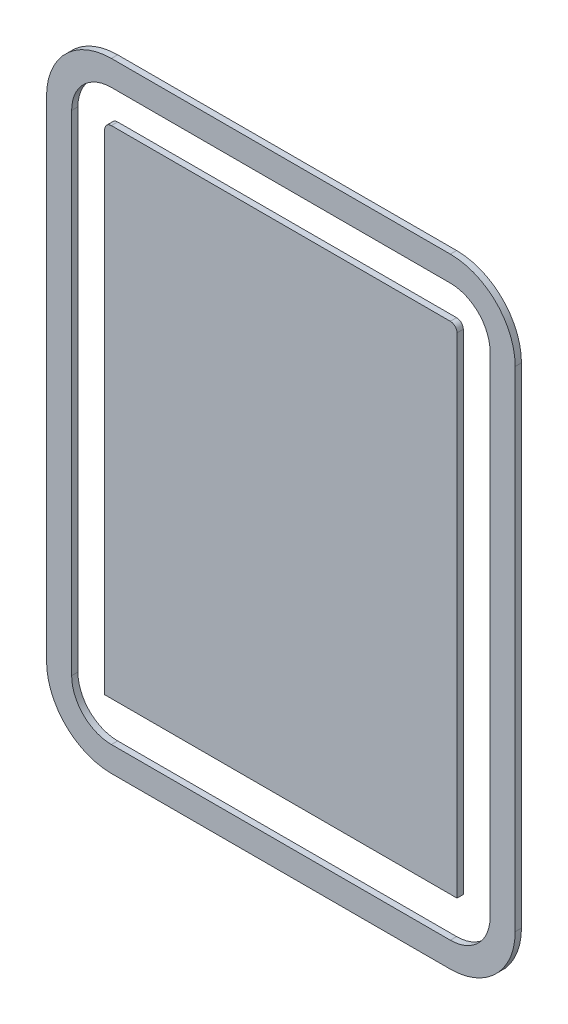
ISO-10303-21;
HEADER;
FILE_DESCRIPTION(('STEP AP214'),'2;1');
FILE_NAME('part.step','',(''),(''),'','','');
FILE_SCHEMA(('AUTOMOTIVE_DESIGN { 1 0 10303 214 1 1 1 1 }'));
ENDSEC;
DATA;
#1=APPLICATION_CONTEXT('core data for automotive mechanical design processes');
#2=APPLICATION_PROTOCOL_DEFINITION('international standard','automotive_design',2000,#1);
#3=PRODUCT_CONTEXT('',#1,'mechanical');
#4=PRODUCT('Part','Part','',(#3));
#5=PRODUCT_RELATED_PRODUCT_CATEGORY('part','',(#4));
#6=PRODUCT_DEFINITION_FORMATION('','',#4);
#7=PRODUCT_DEFINITION_CONTEXT('part definition',#1,'design');
#8=PRODUCT_DEFINITION('design','',#6,#7);
#9=PRODUCT_DEFINITION_SHAPE('','',#8);
#10=(LENGTH_UNIT() NAMED_UNIT(*) SI_UNIT(.MILLI.,.METRE.));
#11=(NAMED_UNIT(*) PLANE_ANGLE_UNIT() SI_UNIT($,.RADIAN.));
#12=(NAMED_UNIT(*) SI_UNIT($,.STERADIAN.) SOLID_ANGLE_UNIT());
#13=UNCERTAINTY_MEASURE_WITH_UNIT(LENGTH_MEASURE(1.E-05),#10,'distance_accuracy_value','');
#14=(GEOMETRIC_REPRESENTATION_CONTEXT(3) GLOBAL_UNCERTAINTY_ASSIGNED_CONTEXT((#13)) GLOBAL_UNIT_ASSIGNED_CONTEXT((#10,
#11,#12)) REPRESENTATION_CONTEXT('',''));
#15=CARTESIAN_POINT('',(0.,0.,0.));
#16=DIRECTION('',(0.,0.,1.));
#17=DIRECTION('',(1.,0.,0.));
#18=AXIS2_PLACEMENT_3D('',#15,#16,#17);
#19=CARTESIAN_POINT('',(0.,37.0709038415657,1.5));
#20=DIRECTION('',(0.,-1.,0.));
#21=DIRECTION('',(1.,0.,0.));
#22=AXIS2_PLACEMENT_3D('',#19,#20,#21);
#23=PLANE('',#22);
#24=DIRECTION('',(-1.,0.,0.));
#25=VECTOR('',#24,1.);
#26=CARTESIAN_POINT('',(0.,37.0709038415657,0.));
#27=LINE('',#26,#25);
#28=CARTESIAN_POINT('',(21.0767327904211,37.0709038415657,0.));
#29=VERTEX_POINT('',#28);
#30=CARTESIAN_POINT('',(-59.9232672095789,37.0709038415657,0.));
#31=VERTEX_POINT('',#30);
#32=EDGE_CURVE('E171',#29,#31,#27,.T.);
#33=ORIENTED_EDGE('',*,*,#32,.T.);
#34=DIRECTION('',(0.,0.,-1.));
#35=VECTOR('',#34,1.);
#36=CARTESIAN_POINT('',(-59.9232672095789,37.0709038415657,1.5));
#37=LINE('',#36,#35);
#38=CARTESIAN_POINT('',(-59.9232672095789,37.0709038415657,1.5));
#39=VERTEX_POINT('',#38);
#40=EDGE_CURVE('E13',#39,#31,#37,.T.);
#41=ORIENTED_EDGE('',*,*,#40,.F.);
#42=DIRECTION('',(-1.,0.,0.));
#43=VECTOR('',#42,1.);
#44=CARTESIAN_POINT('',(0.,37.0709038415657,1.5));
#45=LINE('',#44,#43);
#46=CARTESIAN_POINT('',(21.0767327904211,37.0709038415657,1.5));
#47=VERTEX_POINT('',#46);
#48=EDGE_CURVE('E181',#47,#39,#45,.T.);
#49=ORIENTED_EDGE('',*,*,#48,.F.);
#50=DIRECTION('',(0.,0.,-1.));
#51=VECTOR('',#50,1.);
#52=CARTESIAN_POINT('',(21.0767327904211,37.0709038415657,1.5));
#53=LINE('',#52,#51);
#54=EDGE_CURVE('E167',#47,#29,#53,.T.);
#55=ORIENTED_EDGE('',*,*,#54,.T.);
#56=EDGE_LOOP('',(#33,#41,#49,#55));
#57=FACE_BOUND('',#56,.T.);
#58=ADVANCED_FACE('F87',(#57),#23,.F.);
#59=CARTESIAN_POINT('',(-59.9232672095789,35.4709038415657,1.5));
#60=DIRECTION('',(0.,0.,-1.));
#61=DIRECTION('',(-1.,0.,0.));
#62=AXIS2_PLACEMENT_3D('',#59,#60,#61);
#63=CYLINDRICAL_SURFACE('',#62,1.60000000000001);
#64=CARTESIAN_POINT('',(-59.9232672095789,35.4709038415657,0.));
#65=DIRECTION('',(0.,0.,1.));
#66=DIRECTION('',(1.,0.,0.));
#67=AXIS2_PLACEMENT_3D('',#64,#65,#66);
#68=CIRCLE('',#67,1.60000000000001);
#69=CARTESIAN_POINT('',(-61.5232672095789,35.4709038415657,0.));
#70=VERTEX_POINT('',#69);
#71=EDGE_CURVE('E174',#31,#70,#68,.T.);
#72=ORIENTED_EDGE('',*,*,#71,.T.);
#73=DIRECTION('',(0.,0.,-1.));
#74=VECTOR('',#73,1.);
#75=CARTESIAN_POINT('',(-61.5232672095789,35.4709038415657,1.5));
#76=LINE('',#75,#74);
#77=CARTESIAN_POINT('',(-61.5232672095789,35.4709038415657,1.5));
#78=VERTEX_POINT('',#77);
#79=EDGE_CURVE('E95',#78,#70,#76,.T.);
#80=ORIENTED_EDGE('',*,*,#79,.F.);
#81=CARTESIAN_POINT('',(-59.9232672095789,35.4709038415657,1.5));
#82=DIRECTION('',(0.,0.,1.));
#83=DIRECTION('',(1.,0.,0.));
#84=AXIS2_PLACEMENT_3D('',#81,#82,#83);
#85=CIRCLE('',#84,1.60000000000001);
#86=EDGE_CURVE('E140',#39,#78,#85,.T.);
#87=ORIENTED_EDGE('',*,*,#86,.F.);
#88=ORIENTED_EDGE('',*,*,#40,.T.);
#89=EDGE_LOOP('',(#72,#80,#87,#88));
#90=FACE_BOUND('',#89,.T.);
#91=ADVANCED_FACE('F205',(#90),#63,.T.);
#92=CARTESIAN_POINT('',(-61.5232672095789,0.,1.5));
#93=DIRECTION('',(1.,0.,0.));
#94=DIRECTION('',(0.,1.,0.));
#95=AXIS2_PLACEMENT_3D('',#92,#93,#94);
#96=PLANE('',#95);
#97=DIRECTION('',(0.,-1.,0.));
#98=VECTOR('',#97,1.);
#99=CARTESIAN_POINT('',(-61.5232672095789,0.,0.));
#100=LINE('',#99,#98);
#101=CARTESIAN_POINT('',(-61.5232672095789,-81.5290961584343,0.));
#102=VERTEX_POINT('',#101);
#103=EDGE_CURVE('E176',#70,#102,#100,.T.);
#104=ORIENTED_EDGE('',*,*,#103,.T.);
#105=DIRECTION('',(0.,0.,-1.));
#106=VECTOR('',#105,1.);
#107=CARTESIAN_POINT('',(-61.5232672095789,-81.5290961584343,1.5));
#108=LINE('',#107,#106);
#109=CARTESIAN_POINT('',(-61.5232672095789,-81.5290961584343,1.5));
#110=VERTEX_POINT('',#109);
#111=EDGE_CURVE('E162',#110,#102,#108,.T.);
#112=ORIENTED_EDGE('',*,*,#111,.F.);
#113=DIRECTION('',(0.,-1.,0.));
#114=VECTOR('',#113,1.);
#115=CARTESIAN_POINT('',(-61.5232672095789,0.,1.5));
#116=LINE('',#115,#114);
#117=EDGE_CURVE('E153',#78,#110,#116,.T.);
#118=ORIENTED_EDGE('',*,*,#117,.F.);
#119=ORIENTED_EDGE('',*,*,#79,.T.);
#120=EDGE_LOOP('',(#104,#112,#118,#119));
#121=FACE_BOUND('',#120,.T.);
#122=ADVANCED_FACE('F187',(#121),#96,.F.);
#123=CARTESIAN_POINT('',(0.,-81.5290961584343,1.5));
#124=DIRECTION('',(0.,1.,0.));
#125=DIRECTION('',(0.,0.,1.));
#126=AXIS2_PLACEMENT_3D('',#123,#124,#125);
#127=PLANE('',#126);
#128=DIRECTION('',(1.,0.,0.));
#129=VECTOR('',#128,1.);
#130=CARTESIAN_POINT('',(0.,-81.5290961584343,0.));
#131=LINE('',#130,#129);
#132=CARTESIAN_POINT('',(22.6767327904211,-81.5290961584343,0.));
#133=VERTEX_POINT('',#132);
#134=EDGE_CURVE('E161',#102,#133,#131,.T.);
#135=ORIENTED_EDGE('',*,*,#134,.T.);
#136=DIRECTION('',(0.,0.,-1.));
#137=VECTOR('',#136,1.);
#138=CARTESIAN_POINT('',(22.6767327904211,-81.5290961584343,1.5));
#139=LINE('',#138,#137);
#140=CARTESIAN_POINT('',(22.6767327904211,-81.5290961584343,1.5));
#141=VERTEX_POINT('',#140);
#142=EDGE_CURVE('E158',#141,#133,#139,.T.);
#143=ORIENTED_EDGE('',*,*,#142,.F.);
#144=DIRECTION('',(1.,0.,0.));
#145=VECTOR('',#144,1.);
#146=CARTESIAN_POINT('',(0.,-81.5290961584343,1.5));
#147=LINE('',#146,#145);
#148=EDGE_CURVE('E147',#110,#141,#147,.T.);
#149=ORIENTED_EDGE('',*,*,#148,.F.);
#150=ORIENTED_EDGE('',*,*,#111,.T.);
#151=EDGE_LOOP('',(#135,#143,#149,#150));
#152=FACE_BOUND('',#151,.T.);
#153=ADVANCED_FACE('F159',(#152),#127,.F.);
#154=CARTESIAN_POINT('',(22.6767327904211,0.,1.5));
#155=DIRECTION('',(-1.,0.,0.));
#156=DIRECTION('',(0.,0.,1.));
#157=AXIS2_PLACEMENT_3D('',#154,#155,#156);
#158=PLANE('',#157);
#159=DIRECTION('',(0.,1.,0.));
#160=VECTOR('',#159,1.);
#161=CARTESIAN_POINT('',(22.6767327904211,0.,0.));
#162=LINE('',#161,#160);
#163=CARTESIAN_POINT('',(22.6767327904211,35.4709038415657,0.));
#164=VERTEX_POINT('',#163);
#165=EDGE_CURVE('E126',#133,#164,#162,.T.);
#166=ORIENTED_EDGE('',*,*,#165,.T.);
#167=DIRECTION('',(0.,0.,-1.));
#168=VECTOR('',#167,1.);
#169=CARTESIAN_POINT('',(22.6767327904211,35.4709038415657,1.5));
#170=LINE('',#169,#168);
#171=CARTESIAN_POINT('',(22.6767327904211,35.4709038415657,1.5));
#172=VERTEX_POINT('',#171);
#173=EDGE_CURVE('E163',#172,#164,#170,.T.);
#174=ORIENTED_EDGE('',*,*,#173,.F.);
#175=DIRECTION('',(0.,1.,0.));
#176=VECTOR('',#175,1.);
#177=CARTESIAN_POINT('',(22.6767327904211,0.,1.5));
#178=LINE('',#177,#176);
#179=EDGE_CURVE('E151',#141,#172,#178,.T.);
#180=ORIENTED_EDGE('',*,*,#179,.F.);
#181=ORIENTED_EDGE('',*,*,#142,.T.);
#182=EDGE_LOOP('',(#166,#174,#180,#181));
#183=FACE_BOUND('',#182,.T.);
#184=ADVANCED_FACE('F165',(#183),#158,.F.);
#185=CARTESIAN_POINT('',(21.0767327904211,35.4709038415657,1.5));
#186=DIRECTION('',(0.,0.,-1.));
#187=DIRECTION('',(-1.,0.,0.));
#188=AXIS2_PLACEMENT_3D('',#185,#186,#187);
#189=CYLINDRICAL_SURFACE('',#188,1.6);
#190=CARTESIAN_POINT('',(21.0767327904211,35.4709038415657,0.));
#191=DIRECTION('',(0.,0.,1.));
#192=DIRECTION('',(1.,0.,0.));
#193=AXIS2_PLACEMENT_3D('',#190,#191,#192);
#194=CIRCLE('',#193,1.6);
#195=EDGE_CURVE('E132',#164,#29,#194,.T.);
#196=ORIENTED_EDGE('',*,*,#195,.T.);
#197=ORIENTED_EDGE('',*,*,#54,.F.);
#198=CARTESIAN_POINT('',(21.0767327904211,35.4709038415657,1.5));
#199=DIRECTION('',(0.,0.,1.));
#200=DIRECTION('',(1.,0.,0.));
#201=AXIS2_PLACEMENT_3D('',#198,#199,#200);
#202=CIRCLE('',#201,1.6);
#203=EDGE_CURVE('E103',#172,#47,#202,.T.);
#204=ORIENTED_EDGE('',*,*,#203,.F.);
#205=ORIENTED_EDGE('',*,*,#173,.T.);
#206=EDGE_LOOP('',(#196,#197,#204,#205));
#207=FACE_BOUND('',#206,.T.);
#208=ADVANCED_FACE('F194',(#207),#189,.T.);
#209=CARTESIAN_POINT('',(0.,0.,1.5));
#210=DIRECTION('',(0.,0.,1.));
#211=DIRECTION('',(1.,0.,0.));
#212=AXIS2_PLACEMENT_3D('',#209,#210,#211);
#213=PLANE('',#212);
#214=ORIENTED_EDGE('',*,*,#48,.T.);
#215=ORIENTED_EDGE('',*,*,#86,.T.);
#216=ORIENTED_EDGE('',*,*,#117,.T.);
#217=ORIENTED_EDGE('',*,*,#148,.T.);
#218=ORIENTED_EDGE('',*,*,#179,.T.);
#219=ORIENTED_EDGE('',*,*,#203,.T.);
#220=EDGE_LOOP('',(#214,#215,#216,#217,#218,#219));
#221=FACE_BOUND('',#220,.T.);
#222=ADVANCED_FACE('F149',(#221),#213,.T.);
#223=CARTESIAN_POINT('',(0.,0.,0.));
#224=DIRECTION('',(0.,0.,1.));
#225=DIRECTION('',(1.,0.,0.));
#226=AXIS2_PLACEMENT_3D('',#223,#224,#225);
#227=PLANE('',#226);
#228=ORIENTED_EDGE('',*,*,#32,.F.);
#229=ORIENTED_EDGE('',*,*,#195,.F.);
#230=ORIENTED_EDGE('',*,*,#165,.F.);
#231=ORIENTED_EDGE('',*,*,#134,.F.);
#232=ORIENTED_EDGE('',*,*,#103,.F.);
#233=ORIENTED_EDGE('',*,*,#71,.F.);
#234=EDGE_LOOP('',(#228,#229,#230,#231,#232,#233));
#235=FACE_BOUND('',#234,.T.);
#236=ADVANCED_FACE('F190',(#235),#227,.F.);
#237=CLOSED_SHELL('',(#58,#91,#122,#153,#184,#208,#222,#236));
#238=MANIFOLD_SOLID_BREP('B2',#237);
#239=CARTESIAN_POINT('',(0.,50.9709038415657,1.5));
#240=DIRECTION('',(0.,-1.,0.));
#241=DIRECTION('',(0.,0.,-1.));
#242=AXIS2_PLACEMENT_3D('',#239,#240,#241);
#243=PLANE('',#242);
#244=DIRECTION('',(-1.,0.,0.));
#245=VECTOR('',#244,1.);
#246=CARTESIAN_POINT('',(0.,50.9709038415657,0.));
#247=LINE('',#246,#245);
#248=CARTESIAN_POINT('',(21.0767327904211,50.9709038415657,0.));
#249=VERTEX_POINT('',#248);
#250=CARTESIAN_POINT('',(-59.9232672095789,50.9709038415657,0.));
#251=VERTEX_POINT('',#250);
#252=EDGE_CURVE('E435',#249,#251,#247,.T.);
#253=ORIENTED_EDGE('',*,*,#252,.T.);
#254=DIRECTION('',(0.,0.,-1.));
#255=VECTOR('',#254,1.);
#256=CARTESIAN_POINT('',(-59.9232672095789,50.9709038415657,1.5));
#257=LINE('',#256,#255);
#258=CARTESIAN_POINT('',(-59.9232672095789,50.9709038415657,1.5));
#259=VERTEX_POINT('',#258);
#260=EDGE_CURVE('E85',#259,#251,#257,.T.);
#261=ORIENTED_EDGE('',*,*,#260,.F.);
#262=DIRECTION('',(-1.,0.,0.));
#263=VECTOR('',#262,1.);
#264=CARTESIAN_POINT('',(0.,50.9709038415657,1.5));
#265=LINE('',#264,#263);
#266=CARTESIAN_POINT('',(21.0767327904211,50.9709038415657,1.5));
#267=VERTEX_POINT('',#266);
#268=EDGE_CURVE('E513',#267,#259,#265,.T.);
#269=ORIENTED_EDGE('',*,*,#268,.F.);
#270=DIRECTION('',(0.,0.,-1.));
#271=VECTOR('',#270,1.);
#272=CARTESIAN_POINT('',(21.0767327904211,50.9709038415657,1.5));
#273=LINE('',#272,#271);
#274=EDGE_CURVE('E450',#267,#249,#273,.T.);
#275=ORIENTED_EDGE('',*,*,#274,.T.);
#276=EDGE_LOOP('',(#253,#261,#269,#275));
#277=FACE_BOUND('',#276,.T.);
#278=ADVANCED_FACE('F263',(#277),#243,.F.);
#279=CARTESIAN_POINT('',(-59.9232672095789,35.4709038415657,1.5));
#280=DIRECTION('',(0.,0.,-1.));
#281=DIRECTION('',(-1.,0.,0.));
#282=AXIS2_PLACEMENT_3D('',#279,#280,#281);
#283=CYLINDRICAL_SURFACE('',#282,15.5);
#284=CARTESIAN_POINT('',(-59.9232672095789,35.4709038415657,0.));
#285=DIRECTION('',(0.,0.,1.));
#286=DIRECTION('',(1.,0.,0.));
#287=AXIS2_PLACEMENT_3D('',#284,#285,#286);
#288=CIRCLE('',#287,15.5);
#289=CARTESIAN_POINT('',(-75.4232672095789,35.4709038415657,0.));
#290=VERTEX_POINT('',#289);
#291=EDGE_CURVE('E438',#251,#290,#288,.T.);
#292=ORIENTED_EDGE('',*,*,#291,.T.);
#293=DIRECTION('',(0.,0.,-1.));
#294=VECTOR('',#293,1.);
#295=CARTESIAN_POINT('',(-75.4232672095789,35.4709038415657,1.5));
#296=LINE('',#295,#294);
#297=CARTESIAN_POINT('',(-75.4232672095789,35.4709038415657,1.5));
#298=VERTEX_POINT('',#297);
#299=EDGE_CURVE('E273',#298,#290,#296,.T.);
#300=ORIENTED_EDGE('',*,*,#299,.F.);
#301=CARTESIAN_POINT('',(-59.9232672095789,35.4709038415657,1.5));
#302=DIRECTION('',(0.,0.,1.));
#303=DIRECTION('',(1.,0.,0.));
#304=AXIS2_PLACEMENT_3D('',#301,#302,#303);
#305=CIRCLE('',#304,15.5);
#306=EDGE_CURVE('E515',#259,#298,#305,.T.);
#307=ORIENTED_EDGE('',*,*,#306,.F.);
#308=ORIENTED_EDGE('',*,*,#260,.T.);
#309=EDGE_LOOP('',(#292,#300,#307,#308));
#310=FACE_BOUND('',#309,.T.);
#311=ADVANCED_FACE('F550',(#310),#283,.T.);
#312=CARTESIAN_POINT('',(-75.4232672095789,0.,1.5));
#313=DIRECTION('',(1.,0.,0.));
#314=DIRECTION('',(0.,1.,0.));
#315=AXIS2_PLACEMENT_3D('',#312,#313,#314);
#316=PLANE('',#315);
#317=DIRECTION('',(0.,-1.,0.));
#318=VECTOR('',#317,1.);
#319=CARTESIAN_POINT('',(-75.4232672095789,0.,0.));
#320=LINE('',#319,#318);
#321=CARTESIAN_POINT('',(-75.4232672095789,-81.5290961584343,0.));
#322=VERTEX_POINT('',#321);
#323=EDGE_CURVE('E440',#290,#322,#320,.T.);
#324=ORIENTED_EDGE('',*,*,#323,.T.);
#325=DIRECTION('',(0.,0.,-1.));
#326=VECTOR('',#325,1.);
#327=CARTESIAN_POINT('',(-75.4232672095789,-81.5290961584343,1.5));
#328=LINE('',#327,#326);
#329=CARTESIAN_POINT('',(-75.4232672095789,-81.5290961584343,1.5));
#330=VERTEX_POINT('',#329);
#331=EDGE_CURVE('E457',#330,#322,#328,.T.);
#332=ORIENTED_EDGE('',*,*,#331,.F.);
#333=DIRECTION('',(0.,-1.,0.));
#334=VECTOR('',#333,1.);
#335=CARTESIAN_POINT('',(-75.4232672095789,0.,1.5));
#336=LINE('',#335,#334);
#337=EDGE_CURVE('E517',#298,#330,#336,.T.);
#338=ORIENTED_EDGE('',*,*,#337,.F.);
#339=ORIENTED_EDGE('',*,*,#299,.T.);
#340=EDGE_LOOP('',(#324,#332,#338,#339));
#341=FACE_BOUND('',#340,.T.);
#342=ADVANCED_FACE('F555',(#341),#316,.F.);
#343=CARTESIAN_POINT('',(-59.9232672095789,-81.5290961584343,1.5));
#344=DIRECTION('',(0.,0.,-1.));
#345=DIRECTION('',(-1.,0.,0.));
#346=AXIS2_PLACEMENT_3D('',#343,#344,#345);
#347=CYLINDRICAL_SURFACE('',#346,15.5);
#348=CARTESIAN_POINT('',(-59.9232672095789,-81.5290961584343,0.));
#349=DIRECTION('',(0.,0.,1.));
#350=DIRECTION('',(1.,0.,0.));
#351=AXIS2_PLACEMENT_3D('',#348,#349,#350);
#352=CIRCLE('',#351,15.5);
#353=CARTESIAN_POINT('',(-59.9232672095789,-97.0290961584343,0.));
#354=VERTEX_POINT('',#353);
#355=EDGE_CURVE('E442',#322,#354,#352,.T.);
#356=ORIENTED_EDGE('',*,*,#355,.T.);
#357=DIRECTION('',(0.,0.,-1.));
#358=VECTOR('',#357,1.);
#359=CARTESIAN_POINT('',(-59.9232672095789,-97.0290961584343,1.5));
#360=LINE('',#359,#358);
#361=CARTESIAN_POINT('',(-59.9232672095789,-97.0290961584343,1.5));
#362=VERTEX_POINT('',#361);
#363=EDGE_CURVE('E454',#362,#354,#360,.T.);
#364=ORIENTED_EDGE('',*,*,#363,.F.);
#365=CARTESIAN_POINT('',(-59.9232672095789,-81.5290961584343,1.5));
#366=DIRECTION('',(0.,0.,1.));
#367=DIRECTION('',(1.,0.,0.));
#368=AXIS2_PLACEMENT_3D('',#365,#366,#367);
#369=CIRCLE('',#368,15.5);
#370=EDGE_CURVE('E519',#330,#362,#369,.T.);
#371=ORIENTED_EDGE('',*,*,#370,.F.);
#372=ORIENTED_EDGE('',*,*,#331,.T.);
#373=EDGE_LOOP('',(#356,#364,#371,#372));
#374=FACE_BOUND('',#373,.T.);
#375=ADVANCED_FACE('F525',(#374),#347,.T.);
#376=CARTESIAN_POINT('',(0.,-97.0290961584343,1.5));
#377=DIRECTION('',(0.,1.,0.));
#378=DIRECTION('',(0.,0.,1.));
#379=AXIS2_PLACEMENT_3D('',#376,#377,#378);
#380=PLANE('',#379);
#381=DIRECTION('',(1.,0.,0.));
#382=VECTOR('',#381,1.);
#383=CARTESIAN_POINT('',(0.,-97.0290961584343,0.));
#384=LINE('',#383,#382);
#385=CARTESIAN_POINT('',(21.0767327904211,-97.0290961584343,0.));
#386=VERTEX_POINT('',#385);
#387=EDGE_CURVE('E444',#354,#386,#384,.T.);
#388=ORIENTED_EDGE('',*,*,#387,.T.);
#389=DIRECTION('',(0.,0.,-1.));
#390=VECTOR('',#389,1.);
#391=CARTESIAN_POINT('',(21.0767327904211,-97.0290961584343,1.5));
#392=LINE('',#391,#390);
#393=CARTESIAN_POINT('',(21.0767327904211,-97.0290961584343,1.5));
#394=VERTEX_POINT('',#393);
#395=EDGE_CURVE('E402',#394,#386,#392,.T.);
#396=ORIENTED_EDGE('',*,*,#395,.F.);
#397=DIRECTION('',(1.,0.,0.));
#398=VECTOR('',#397,1.);
#399=CARTESIAN_POINT('',(0.,-97.0290961584343,1.5));
#400=LINE('',#399,#398);
#401=EDGE_CURVE('E393',#362,#394,#400,.T.);
#402=ORIENTED_EDGE('',*,*,#401,.F.);
#403=ORIENTED_EDGE('',*,*,#363,.T.);
#404=EDGE_LOOP('',(#388,#396,#402,#403));
#405=FACE_BOUND('',#404,.T.);
#406=ADVANCED_FACE('F529',(#405),#380,.F.);
#407=CARTESIAN_POINT('',(21.0767327904211,-81.5290961584343,1.5));
#408=DIRECTION('',(0.,0.,-1.));
#409=DIRECTION('',(-1.,0.,0.));
#410=AXIS2_PLACEMENT_3D('',#407,#408,#409);
#411=CYLINDRICAL_SURFACE('',#410,15.5);
#412=CARTESIAN_POINT('',(21.0767327904211,-81.5290961584343,0.));
#413=DIRECTION('',(0.,0.,1.));
#414=DIRECTION('',(1.,0.,0.));
#415=AXIS2_PLACEMENT_3D('',#412,#413,#414);
#416=CIRCLE('',#415,15.5);
#417=CARTESIAN_POINT('',(36.5767327904211,-81.5290961584343,0.));
#418=VERTEX_POINT('',#417);
#419=EDGE_CURVE('E401',#386,#418,#416,.T.);
#420=ORIENTED_EDGE('',*,*,#419,.T.);
#421=DIRECTION('',(0.,0.,-1.));
#422=VECTOR('',#421,1.);
#423=CARTESIAN_POINT('',(36.5767327904211,-81.5290961584343,1.5));
#424=LINE('',#423,#422);
#425=CARTESIAN_POINT('',(36.5767327904211,-81.5290961584343,1.5));
#426=VERTEX_POINT('',#425);
#427=EDGE_CURVE('E398',#426,#418,#424,.T.);
#428=ORIENTED_EDGE('',*,*,#427,.F.);
#429=CARTESIAN_POINT('',(21.0767327904211,-81.5290961584343,1.5));
#430=DIRECTION('',(0.,0.,1.));
#431=DIRECTION('',(1.,0.,0.));
#432=AXIS2_PLACEMENT_3D('',#429,#430,#431);
#433=CIRCLE('',#432,15.5);
#434=EDGE_CURVE('E387',#394,#426,#433,.T.);
#435=ORIENTED_EDGE('',*,*,#434,.F.);
#436=ORIENTED_EDGE('',*,*,#395,.T.);
#437=EDGE_LOOP('',(#420,#428,#435,#436));
#438=FACE_BOUND('',#437,.T.);
#439=ADVANCED_FACE('F399',(#438),#411,.T.);
#440=CARTESIAN_POINT('',(36.5767327904211,0.,1.5));
#441=DIRECTION('',(-1.,0.,0.));
#442=DIRECTION('',(0.,-1.,0.));
#443=AXIS2_PLACEMENT_3D('',#440,#441,#442);
#444=PLANE('',#443);
#445=DIRECTION('',(0.,1.,0.));
#446=VECTOR('',#445,1.);
#447=CARTESIAN_POINT('',(36.5767327904211,0.,0.));
#448=LINE('',#447,#446);
#449=CARTESIAN_POINT('',(36.5767327904211,35.4709038415657,0.));
#450=VERTEX_POINT('',#449);
#451=EDGE_CURVE('E335',#418,#450,#448,.T.);
#452=ORIENTED_EDGE('',*,*,#451,.T.);
#453=DIRECTION('',(0.,0.,-1.));
#454=VECTOR('',#453,1.);
#455=CARTESIAN_POINT('',(36.5767327904211,35.4709038415657,1.5));
#456=LINE('',#455,#454);
#457=CARTESIAN_POINT('',(36.5767327904211,35.4709038415657,1.5));
#458=VERTEX_POINT('',#457);
#459=EDGE_CURVE('E403',#458,#450,#456,.T.);
#460=ORIENTED_EDGE('',*,*,#459,.F.);
#461=DIRECTION('',(0.,1.,0.));
#462=VECTOR('',#461,1.);
#463=CARTESIAN_POINT('',(36.5767327904211,0.,1.5));
#464=LINE('',#463,#462);
#465=EDGE_CURVE('E391',#426,#458,#464,.T.);
#466=ORIENTED_EDGE('',*,*,#465,.F.);
#467=ORIENTED_EDGE('',*,*,#427,.T.);
#468=EDGE_LOOP('',(#452,#460,#466,#467));
#469=FACE_BOUND('',#468,.T.);
#470=ADVANCED_FACE('F405',(#469),#444,.F.);
#471=CARTESIAN_POINT('',(-59.9232672095789,35.4709038415657,1.5));
#472=DIRECTION('',(0.,0.,-1.));
#473=DIRECTION('',(-1.,0.,0.));
#474=AXIS2_PLACEMENT_3D('',#471,#472,#473);
#475=CYLINDRICAL_SURFACE('',#474,9.5);
#476=CARTESIAN_POINT('',(-59.9232672095789,35.4709038415657,0.));
#477=DIRECTION('',(0.,0.,1.));
#478=DIRECTION('',(1.,0.,0.));
#479=AXIS2_PLACEMENT_3D('',#476,#477,#478);
#480=CIRCLE('',#479,9.5);
#481=CARTESIAN_POINT('',(-59.9232672095789,44.9709038415657,0.));
#482=VERTEX_POINT('',#481);
#483=CARTESIAN_POINT('',(-69.4232672095789,35.4709038415657,0.));
#484=VERTEX_POINT('',#483);
#485=EDGE_CURVE('E411',#482,#484,#480,.T.);
#486=ORIENTED_EDGE('',*,*,#485,.F.);
#487=DIRECTION('',(0.,0.,-1.));
#488=VECTOR('',#487,1.);
#489=CARTESIAN_POINT('',(-59.9232672095789,44.9709038415657,1.5));
#490=LINE('',#489,#488);
#491=CARTESIAN_POINT('',(-59.9232672095789,44.9709038415657,1.5));
#492=VERTEX_POINT('',#491);
#493=EDGE_CURVE('E267',#492,#482,#490,.T.);
#494=ORIENTED_EDGE('',*,*,#493,.F.);
#495=CARTESIAN_POINT('',(-59.9232672095789,35.4709038415657,1.5));
#496=DIRECTION('',(0.,0.,1.));
#497=DIRECTION('',(1.,0.,0.));
#498=AXIS2_PLACEMENT_3D('',#495,#496,#497);
#499=CIRCLE('',#498,9.5);
#500=CARTESIAN_POINT('',(-69.4232672095789,35.4709038415657,1.5));
#501=VERTEX_POINT('',#500);
#502=EDGE_CURVE('E449',#492,#501,#499,.T.);
#503=ORIENTED_EDGE('',*,*,#502,.T.);
#504=DIRECTION('',(0.,0.,-1.));
#505=VECTOR('',#504,1.);
#506=CARTESIAN_POINT('',(-69.4232672095789,35.4709038415657,1.5));
#507=LINE('',#506,#505);
#508=EDGE_CURVE('E407',#501,#484,#507,.T.);
#509=ORIENTED_EDGE('',*,*,#508,.T.);
#510=EDGE_LOOP('',(#486,#494,#503,#509));
#511=FACE_BOUND('',#510,.T.);
#512=ADVANCED_FACE('F265',(#511),#475,.F.);
#513=CARTESIAN_POINT('',(0.,44.9709038415657,1.5));
#514=DIRECTION('',(0.,-1.,0.));
#515=DIRECTION('',(0.,0.,-1.));
#516=AXIS2_PLACEMENT_3D('',#513,#514,#515);
#517=PLANE('',#516);
#518=DIRECTION('',(-1.,0.,0.));
#519=VECTOR('',#518,1.);
#520=CARTESIAN_POINT('',(0.,44.9709038415657,0.));
#521=LINE('',#520,#519);
#522=CARTESIAN_POINT('',(21.0767327904211,44.9709038415657,0.));
#523=VERTEX_POINT('',#522);
#524=EDGE_CURVE('E414',#523,#482,#521,.T.);
#525=ORIENTED_EDGE('',*,*,#524,.F.);
#526=DIRECTION('',(0.,0.,-1.));
#527=VECTOR('',#526,1.);
#528=CARTESIAN_POINT('',(21.0767327904211,44.9709038415657,1.5));
#529=LINE('',#528,#527);
#530=CARTESIAN_POINT('',(21.0767327904211,44.9709038415657,1.5));
#531=VERTEX_POINT('',#530);
#532=EDGE_CURVE('E472',#531,#523,#529,.T.);
#533=ORIENTED_EDGE('',*,*,#532,.F.);
#534=DIRECTION('',(-1.,0.,0.));
#535=VECTOR('',#534,1.);
#536=CARTESIAN_POINT('',(0.,44.9709038415657,1.5));
#537=LINE('',#536,#535);
#538=EDGE_CURVE('E481',#531,#492,#537,.T.);
#539=ORIENTED_EDGE('',*,*,#538,.T.);
#540=ORIENTED_EDGE('',*,*,#493,.T.);
#541=EDGE_LOOP('',(#525,#533,#539,#540));
#542=FACE_BOUND('',#541,.T.);
#543=ADVANCED_FACE('F479',(#542),#517,.T.);
#544=CARTESIAN_POINT('',(21.0767327904211,35.4709038415657,1.5));
#545=DIRECTION('',(0.,0.,-1.));
#546=DIRECTION('',(-1.,0.,0.));
#547=AXIS2_PLACEMENT_3D('',#544,#545,#546);
#548=CYLINDRICAL_SURFACE('',#547,9.5);
#549=CARTESIAN_POINT('',(21.0767327904211,35.4709038415657,0.));
#550=DIRECTION('',(0.,0.,1.));
#551=DIRECTION('',(1.,0.,0.));
#552=AXIS2_PLACEMENT_3D('',#549,#550,#551);
#553=CIRCLE('',#552,9.5);
#554=CARTESIAN_POINT('',(30.5767327904211,35.4709038415657,0.));
#555=VERTEX_POINT('',#554);
#556=EDGE_CURVE('E417',#555,#523,#553,.T.);
#557=ORIENTED_EDGE('',*,*,#556,.F.);
#558=DIRECTION('',(0.,0.,-1.));
#559=VECTOR('',#558,1.);
#560=CARTESIAN_POINT('',(30.5767327904211,35.4709038415657,1.5));
#561=LINE('',#560,#559);
#562=CARTESIAN_POINT('',(30.5767327904211,35.4709038415657,1.5));
#563=VERTEX_POINT('',#562);
#564=EDGE_CURVE('E471',#563,#555,#561,.T.);
#565=ORIENTED_EDGE('',*,*,#564,.F.);
#566=CARTESIAN_POINT('',(21.0767327904211,35.4709038415657,1.5));
#567=DIRECTION('',(0.,0.,1.));
#568=DIRECTION('',(1.,0.,0.));
#569=AXIS2_PLACEMENT_3D('',#566,#567,#568);
#570=CIRCLE('',#569,9.5);
#571=EDGE_CURVE('E489',#563,#531,#570,.T.);
#572=ORIENTED_EDGE('',*,*,#571,.T.);
#573=ORIENTED_EDGE('',*,*,#532,.T.);
#574=EDGE_LOOP('',(#557,#565,#572,#573));
#575=FACE_BOUND('',#574,.T.);
#576=ADVANCED_FACE('F487',(#575),#548,.F.);
#577=CARTESIAN_POINT('',(30.5767327904211,0.,1.5));
#578=DIRECTION('',(-1.,0.,0.));
#579=DIRECTION('',(0.,-1.,0.));
#580=AXIS2_PLACEMENT_3D('',#577,#578,#579);
#581=PLANE('',#580);
#582=DIRECTION('',(0.,1.,0.));
#583=VECTOR('',#582,1.);
#584=CARTESIAN_POINT('',(30.5767327904211,0.,0.));
#585=LINE('',#584,#583);
#586=CARTESIAN_POINT('',(30.5767327904211,-81.5290961584343,0.));
#587=VERTEX_POINT('',#586);
#588=EDGE_CURVE('E420',#587,#555,#585,.T.);
#589=ORIENTED_EDGE('',*,*,#588,.F.);
#590=DIRECTION('',(0.,0.,-1.));
#591=VECTOR('',#590,1.);
#592=CARTESIAN_POINT('',(30.5767327904211,-81.5290961584343,1.5));
#593=LINE('',#592,#591);
#594=CARTESIAN_POINT('',(30.5767327904211,-81.5290961584343,1.5));
#595=VERTEX_POINT('',#594);
#596=EDGE_CURVE('E469',#595,#587,#593,.T.);
#597=ORIENTED_EDGE('',*,*,#596,.F.);
#598=DIRECTION('',(0.,1.,0.));
#599=VECTOR('',#598,1.);
#600=CARTESIAN_POINT('',(30.5767327904211,0.,1.5));
#601=LINE('',#600,#599);
#602=EDGE_CURVE('E495',#595,#563,#601,.T.);
#603=ORIENTED_EDGE('',*,*,#602,.T.);
#604=ORIENTED_EDGE('',*,*,#564,.T.);
#605=EDGE_LOOP('',(#589,#597,#603,#604));
#606=FACE_BOUND('',#605,.T.);
#607=ADVANCED_FACE('F498',(#606),#581,.T.);
#608=CARTESIAN_POINT('',(21.0767327904211,-81.5290961584343,1.5));
#609=DIRECTION('',(0.,0.,-1.));
#610=DIRECTION('',(-1.,0.,0.));
#611=AXIS2_PLACEMENT_3D('',#608,#609,#610);
#612=CYLINDRICAL_SURFACE('',#611,9.49999999999999);
#613=CARTESIAN_POINT('',(21.0767327904211,-81.5290961584343,0.));
#614=DIRECTION('',(0.,0.,1.));
#615=DIRECTION('',(1.,0.,0.));
#616=AXIS2_PLACEMENT_3D('',#613,#614,#615);
#617=CIRCLE('',#616,9.49999999999999);
#618=CARTESIAN_POINT('',(21.0767327904211,-91.0290961584343,0.));
#619=VERTEX_POINT('',#618);
#620=EDGE_CURVE('E423',#619,#587,#617,.T.);
#621=ORIENTED_EDGE('',*,*,#620,.F.);
#622=DIRECTION('',(0.,0.,-1.));
#623=VECTOR('',#622,1.);
#624=CARTESIAN_POINT('',(21.0767327904211,-91.0290961584343,1.5));
#625=LINE('',#624,#623);
#626=CARTESIAN_POINT('',(21.0767327904211,-91.0290961584343,1.5));
#627=VERTEX_POINT('',#626);
#628=EDGE_CURVE('E467',#627,#619,#625,.T.);
#629=ORIENTED_EDGE('',*,*,#628,.F.);
#630=CARTESIAN_POINT('',(21.0767327904211,-81.5290961584343,1.5));
#631=DIRECTION('',(0.,0.,1.));
#632=DIRECTION('',(1.,0.,0.));
#633=AXIS2_PLACEMENT_3D('',#630,#631,#632);
#634=CIRCLE('',#633,9.49999999999999);
#635=EDGE_CURVE('E499',#627,#595,#634,.T.);
#636=ORIENTED_EDGE('',*,*,#635,.T.);
#637=ORIENTED_EDGE('',*,*,#596,.T.);
#638=EDGE_LOOP('',(#621,#629,#636,#637));
#639=FACE_BOUND('',#638,.T.);
#640=ADVANCED_FACE('F566',(#639),#612,.F.);
#641=CARTESIAN_POINT('',(0.,-91.0290961584343,1.5));
#642=DIRECTION('',(0.,1.,0.));
#643=DIRECTION('',(0.,0.,1.));
#644=AXIS2_PLACEMENT_3D('',#641,#642,#643);
#645=PLANE('',#644);
#646=DIRECTION('',(1.,0.,0.));
#647=VECTOR('',#646,1.);
#648=CARTESIAN_POINT('',(0.,-91.0290961584343,0.));
#649=LINE('',#648,#647);
#650=CARTESIAN_POINT('',(-59.9232672095789,-91.0290961584343,0.));
#651=VERTEX_POINT('',#650);
#652=EDGE_CURVE('E426',#651,#619,#649,.T.);
#653=ORIENTED_EDGE('',*,*,#652,.F.);
#654=DIRECTION('',(0.,0.,-1.));
#655=VECTOR('',#654,1.);
#656=CARTESIAN_POINT('',(-59.9232672095789,-91.0290961584343,1.5));
#657=LINE('',#656,#655);
#658=CARTESIAN_POINT('',(-59.9232672095789,-91.0290961584343,1.5));
#659=VERTEX_POINT('',#658);
#660=EDGE_CURVE('E465',#659,#651,#657,.T.);
#661=ORIENTED_EDGE('',*,*,#660,.F.);
#662=DIRECTION('',(1.,0.,0.));
#663=VECTOR('',#662,1.);
#664=CARTESIAN_POINT('',(0.,-91.0290961584343,1.5));
#665=LINE('',#664,#663);
#666=EDGE_CURVE('E501',#659,#627,#665,.T.);
#667=ORIENTED_EDGE('',*,*,#666,.T.);
#668=ORIENTED_EDGE('',*,*,#628,.T.);
#669=EDGE_LOOP('',(#653,#661,#667,#668));
#670=FACE_BOUND('',#669,.T.);
#671=ADVANCED_FACE('F562',(#670),#645,.T.);
#672=CARTESIAN_POINT('',(-59.9232672095789,-81.5290961584343,1.5));
#673=DIRECTION('',(0.,0.,-1.));
#674=DIRECTION('',(-1.,0.,0.));
#675=AXIS2_PLACEMENT_3D('',#672,#673,#674);
#676=CYLINDRICAL_SURFACE('',#675,9.5);
#677=CARTESIAN_POINT('',(-59.9232672095789,-81.5290961584343,0.));
#678=DIRECTION('',(0.,0.,1.));
#679=DIRECTION('',(1.,0.,0.));
#680=AXIS2_PLACEMENT_3D('',#677,#678,#679);
#681=CIRCLE('',#680,9.5);
#682=CARTESIAN_POINT('',(-69.4232672095789,-81.5290961584343,0.));
#683=VERTEX_POINT('',#682);
#684=EDGE_CURVE('E429',#683,#651,#681,.T.);
#685=ORIENTED_EDGE('',*,*,#684,.F.);
#686=DIRECTION('',(0.,0.,-1.));
#687=VECTOR('',#686,1.);
#688=CARTESIAN_POINT('',(-69.4232672095789,-81.5290961584343,1.5));
#689=LINE('',#688,#687);
#690=CARTESIAN_POINT('',(-69.4232672095789,-81.5290961584343,1.5));
#691=VERTEX_POINT('',#690);
#692=EDGE_CURVE('E463',#691,#683,#689,.T.);
#693=ORIENTED_EDGE('',*,*,#692,.F.);
#694=CARTESIAN_POINT('',(-59.9232672095789,-81.5290961584343,1.5));
#695=DIRECTION('',(0.,0.,1.));
#696=DIRECTION('',(1.,0.,0.));
#697=AXIS2_PLACEMENT_3D('',#694,#695,#696);
#698=CIRCLE('',#697,9.5);
#699=EDGE_CURVE('E507',#691,#659,#698,.T.);
#700=ORIENTED_EDGE('',*,*,#699,.T.);
#701=ORIENTED_EDGE('',*,*,#660,.T.);
#702=EDGE_LOOP('',(#685,#693,#700,#701));
#703=FACE_BOUND('',#702,.T.);
#704=ADVANCED_FACE('F544',(#703),#676,.F.);
#705=CARTESIAN_POINT('',(-69.4232672095789,0.,1.5));
#706=DIRECTION('',(1.,0.,0.));
#707=DIRECTION('',(0.,0.,-1.));
#708=AXIS2_PLACEMENT_3D('',#705,#706,#707);
#709=PLANE('',#708);
#710=DIRECTION('',(0.,-1.,0.));
#711=VECTOR('',#710,1.);
#712=CARTESIAN_POINT('',(-69.4232672095789,0.,0.));
#713=LINE('',#712,#711);
#714=EDGE_CURVE('E432',#484,#683,#713,.T.);
#715=ORIENTED_EDGE('',*,*,#714,.F.);
#716=ORIENTED_EDGE('',*,*,#508,.F.);
#717=DIRECTION('',(0.,-1.,0.));
#718=VECTOR('',#717,1.);
#719=CARTESIAN_POINT('',(-69.4232672095789,0.,1.5));
#720=LINE('',#719,#718);
#721=EDGE_CURVE('E510',#501,#691,#720,.T.);
#722=ORIENTED_EDGE('',*,*,#721,.T.);
#723=ORIENTED_EDGE('',*,*,#692,.T.);
#724=EDGE_LOOP('',(#715,#716,#722,#723));
#725=FACE_BOUND('',#724,.T.);
#726=ADVANCED_FACE('F537',(#725),#709,.T.);
#727=CARTESIAN_POINT('',(21.0767327904211,35.4709038415657,1.5));
#728=DIRECTION('',(0.,0.,-1.));
#729=DIRECTION('',(-1.,0.,0.));
#730=AXIS2_PLACEMENT_3D('',#727,#728,#729);
#731=CYLINDRICAL_SURFACE('',#730,15.5);
#732=CARTESIAN_POINT('',(21.0767327904211,35.4709038415657,0.));
#733=DIRECTION('',(0.,0.,1.));
#734=DIRECTION('',(1.,0.,0.));
#735=AXIS2_PLACEMENT_3D('',#732,#733,#734);
#736=CIRCLE('',#735,15.5);
#737=EDGE_CURVE('E341',#450,#249,#736,.T.);
#738=ORIENTED_EDGE('',*,*,#737,.T.);
#739=ORIENTED_EDGE('',*,*,#274,.F.);
#740=CARTESIAN_POINT('',(21.0767327904211,35.4709038415657,1.5));
#741=DIRECTION('',(0.,0.,1.));
#742=DIRECTION('',(1.,0.,0.));
#743=AXIS2_PLACEMENT_3D('',#740,#741,#742);
#744=CIRCLE('',#743,15.5);
#745=EDGE_CURVE('E282',#458,#267,#744,.T.);
#746=ORIENTED_EDGE('',*,*,#745,.F.);
#747=ORIENTED_EDGE('',*,*,#459,.T.);
#748=EDGE_LOOP('',(#738,#739,#746,#747));
#749=FACE_BOUND('',#748,.T.);
#750=ADVANCED_FACE('F535',(#749),#731,.T.);
#751=CARTESIAN_POINT('',(0.,0.,1.5));
#752=DIRECTION('',(0.,0.,1.));
#753=DIRECTION('',(1.,0.,0.));
#754=AXIS2_PLACEMENT_3D('',#751,#752,#753);
#755=PLANE('',#754);
#756=ORIENTED_EDGE('',*,*,#502,.F.);
#757=ORIENTED_EDGE('',*,*,#538,.F.);
#758=ORIENTED_EDGE('',*,*,#571,.F.);
#759=ORIENTED_EDGE('',*,*,#602,.F.);
#760=ORIENTED_EDGE('',*,*,#635,.F.);
#761=ORIENTED_EDGE('',*,*,#666,.F.);
#762=ORIENTED_EDGE('',*,*,#699,.F.);
#763=ORIENTED_EDGE('',*,*,#721,.F.);
#764=EDGE_LOOP('',(#756,#757,#758,#759,#760,#761,#762,#763));
#765=FACE_BOUND('',#764,.T.);
#766=ORIENTED_EDGE('',*,*,#268,.T.);
#767=ORIENTED_EDGE('',*,*,#306,.T.);
#768=ORIENTED_EDGE('',*,*,#337,.T.);
#769=ORIENTED_EDGE('',*,*,#370,.T.);
#770=ORIENTED_EDGE('',*,*,#401,.T.);
#771=ORIENTED_EDGE('',*,*,#434,.T.);
#772=ORIENTED_EDGE('',*,*,#465,.T.);
#773=ORIENTED_EDGE('',*,*,#745,.T.);
#774=EDGE_LOOP('',(#766,#767,#768,#769,#770,#771,#772,#773));
#775=FACE_BOUND('',#774,.T.);
#776=ADVANCED_FACE('F389',(#765,#775),#755,.T.);
#777=CARTESIAN_POINT('',(0.,0.,0.));
#778=DIRECTION('',(0.,0.,1.));
#779=DIRECTION('',(1.,0.,0.));
#780=AXIS2_PLACEMENT_3D('',#777,#778,#779);
#781=PLANE('',#780);
#782=ORIENTED_EDGE('',*,*,#485,.T.);
#783=ORIENTED_EDGE('',*,*,#714,.T.);
#784=ORIENTED_EDGE('',*,*,#684,.T.);
#785=ORIENTED_EDGE('',*,*,#652,.T.);
#786=ORIENTED_EDGE('',*,*,#620,.T.);
#787=ORIENTED_EDGE('',*,*,#588,.T.);
#788=ORIENTED_EDGE('',*,*,#556,.T.);
#789=ORIENTED_EDGE('',*,*,#524,.T.);
#790=EDGE_LOOP('',(#782,#783,#784,#785,#786,#787,#788,#789));
#791=FACE_BOUND('',#790,.T.);
#792=ORIENTED_EDGE('',*,*,#252,.F.);
#793=ORIENTED_EDGE('',*,*,#737,.F.);
#794=ORIENTED_EDGE('',*,*,#451,.F.);
#795=ORIENTED_EDGE('',*,*,#419,.F.);
#796=ORIENTED_EDGE('',*,*,#387,.F.);
#797=ORIENTED_EDGE('',*,*,#355,.F.);
#798=ORIENTED_EDGE('',*,*,#323,.F.);
#799=ORIENTED_EDGE('',*,*,#291,.F.);
#800=EDGE_LOOP('',(#792,#793,#794,#795,#796,#797,#798,#799));
#801=FACE_BOUND('',#800,.T.);
#802=ADVANCED_FACE('F484',(#791,#801),#781,.F.);
#803=CLOSED_SHELL('',(#278,#311,#342,#375,#406,#439,#470,#512,#543,#576,#607,#640,#671,#704,
#726,#750,#776,#802));
#804=MANIFOLD_SOLID_BREP('B7',#803);
#805=ADVANCED_BREP_SHAPE_REPRESENTATION('',(#18,#238,#804),#14);
#806=SHAPE_DEFINITION_REPRESENTATION(#9,#805);
ENDSEC;
END-ISO-10303-21;
